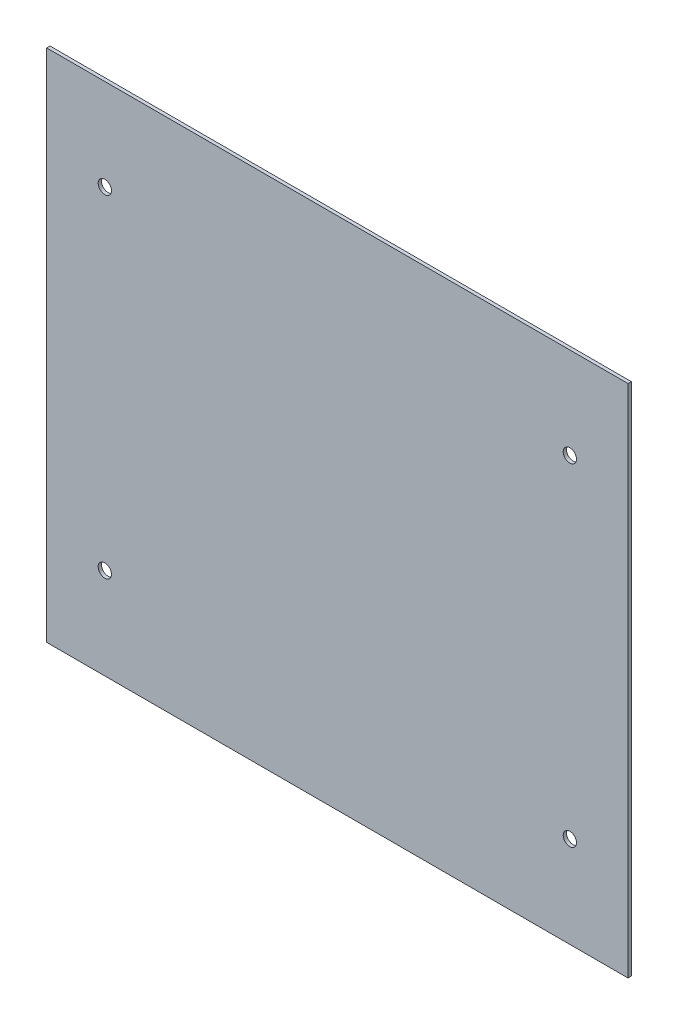
ISO-10303-21;
HEADER;
FILE_DESCRIPTION(('STEP AP214'),'2;1');
FILE_NAME('part.step','',(''),(''),'','','');
FILE_SCHEMA(('AUTOMOTIVE_DESIGN { 1 0 10303 214 1 1 1 1 }'));
ENDSEC;
DATA;
#1=APPLICATION_CONTEXT('core data for automotive mechanical design processes');
#2=APPLICATION_PROTOCOL_DEFINITION('international standard','automotive_design',2000,#1);
#3=PRODUCT_CONTEXT('',#1,'mechanical');
#4=PRODUCT('Part','Part','',(#3));
#5=PRODUCT_RELATED_PRODUCT_CATEGORY('part','',(#4));
#6=PRODUCT_DEFINITION_FORMATION('','',#4);
#7=PRODUCT_DEFINITION_CONTEXT('part definition',#1,'design');
#8=PRODUCT_DEFINITION('design','',#6,#7);
#9=PRODUCT_DEFINITION_SHAPE('','',#8);
#10=(LENGTH_UNIT() NAMED_UNIT(*) SI_UNIT(.MILLI.,.METRE.));
#11=(NAMED_UNIT(*) PLANE_ANGLE_UNIT() SI_UNIT($,.RADIAN.));
#12=(NAMED_UNIT(*) SI_UNIT($,.STERADIAN.) SOLID_ANGLE_UNIT());
#13=UNCERTAINTY_MEASURE_WITH_UNIT(LENGTH_MEASURE(1.E-05),#10,'distance_accuracy_value','');
#14=(GEOMETRIC_REPRESENTATION_CONTEXT(3) GLOBAL_UNCERTAINTY_ASSIGNED_CONTEXT((#13)) GLOBAL_UNIT_ASSIGNED_CONTEXT((#10,
#11,#12)) REPRESENTATION_CONTEXT('',''));
#15=CARTESIAN_POINT('',(0.,0.,0.));
#16=DIRECTION('',(0.,0.,1.));
#17=DIRECTION('',(1.,0.,0.));
#18=AXIS2_PLACEMENT_3D('',#15,#16,#17);
#19=CARTESIAN_POINT('',(-175.,-155.,2.));
#20=DIRECTION('',(1.,0.,0.));
#21=DIRECTION('',(0.,0.,-1.));
#22=AXIS2_PLACEMENT_3D('',#19,#20,#21);
#23=PLANE('',#22);
#24=DIRECTION('',(0.,-1.,0.));
#25=VECTOR('',#24,1.);
#26=CARTESIAN_POINT('',(-175.,-155.,0.));
#27=LINE('',#26,#25);
#28=CARTESIAN_POINT('',(-175.,155.,0.));
#29=VERTEX_POINT('',#28);
#30=CARTESIAN_POINT('',(-175.,-155.,0.));
#31=VERTEX_POINT('',#30);
#32=EDGE_CURVE('E96',#29,#31,#27,.T.);
#33=ORIENTED_EDGE('',*,*,#32,.T.);
#34=DIRECTION('',(0.,0.,-1.));
#35=VECTOR('',#34,1.);
#36=CARTESIAN_POINT('',(-175.,-155.,2.));
#37=LINE('',#36,#35);
#38=CARTESIAN_POINT('',(-175.,-155.,2.));
#39=VERTEX_POINT('',#38);
#40=EDGE_CURVE('E11',#39,#31,#37,.T.);
#41=ORIENTED_EDGE('',*,*,#40,.F.);
#42=DIRECTION('',(0.,-1.,0.));
#43=VECTOR('',#42,1.);
#44=CARTESIAN_POINT('',(-175.,-155.,2.));
#45=LINE('',#44,#43);
#46=CARTESIAN_POINT('',(-175.,155.,2.));
#47=VERTEX_POINT('',#46);
#48=EDGE_CURVE('E84',#47,#39,#45,.T.);
#49=ORIENTED_EDGE('',*,*,#48,.F.);
#50=DIRECTION('',(0.,0.,-1.));
#51=VECTOR('',#50,1.);
#52=CARTESIAN_POINT('',(-175.,155.,2.));
#53=LINE('',#52,#51);
#54=EDGE_CURVE('E92',#47,#29,#53,.T.);
#55=ORIENTED_EDGE('',*,*,#54,.T.);
#56=EDGE_LOOP('',(#33,#41,#49,#55));
#57=FACE_BOUND('',#56,.T.);
#58=ADVANCED_FACE('F33',(#57),#23,.F.);
#59=CARTESIAN_POINT('',(175.,-155.,2.));
#60=DIRECTION('',(0.,1.,0.));
#61=DIRECTION('',(-1.,0.,0.));
#62=AXIS2_PLACEMENT_3D('',#59,#60,#61);
#63=PLANE('',#62);
#64=DIRECTION('',(1.,0.,0.));
#65=VECTOR('',#64,1.);
#66=CARTESIAN_POINT('',(175.,-155.,0.));
#67=LINE('',#66,#65);
#68=CARTESIAN_POINT('',(175.,-155.,0.));
#69=VERTEX_POINT('',#68);
#70=EDGE_CURVE('E88',#31,#69,#67,.T.);
#71=ORIENTED_EDGE('',*,*,#70,.T.);
#72=DIRECTION('',(0.,0.,-1.));
#73=VECTOR('',#72,1.);
#74=CARTESIAN_POINT('',(175.,-155.,2.));
#75=LINE('',#74,#73);
#76=CARTESIAN_POINT('',(175.,-155.,2.));
#77=VERTEX_POINT('',#76);
#78=EDGE_CURVE('E41',#77,#69,#75,.T.);
#79=ORIENTED_EDGE('',*,*,#78,.F.);
#80=DIRECTION('',(1.,0.,0.));
#81=VECTOR('',#80,1.);
#82=CARTESIAN_POINT('',(175.,-155.,2.));
#83=LINE('',#82,#81);
#84=EDGE_CURVE('E79',#39,#77,#83,.T.);
#85=ORIENTED_EDGE('',*,*,#84,.F.);
#86=ORIENTED_EDGE('',*,*,#40,.T.);
#87=EDGE_LOOP('',(#71,#79,#85,#86));
#88=FACE_BOUND('',#87,.T.);
#89=ADVANCED_FACE('F87',(#88),#63,.F.);
#90=CARTESIAN_POINT('',(175.,-155.,2.));
#91=DIRECTION('',(-1.,0.,0.));
#92=DIRECTION('',(0.,0.,1.));
#93=AXIS2_PLACEMENT_3D('',#90,#91,#92);
#94=PLANE('',#93);
#95=DIRECTION('',(0.,1.,0.));
#96=VECTOR('',#95,1.);
#97=CARTESIAN_POINT('',(175.,-155.,0.));
#98=LINE('',#97,#96);
#99=CARTESIAN_POINT('',(175.,155.,0.));
#100=VERTEX_POINT('',#99);
#101=EDGE_CURVE('E66',#69,#100,#98,.T.);
#102=ORIENTED_EDGE('',*,*,#101,.T.);
#103=DIRECTION('',(0.,0.,-1.));
#104=VECTOR('',#103,1.);
#105=CARTESIAN_POINT('',(175.,155.,2.));
#106=LINE('',#105,#104);
#107=CARTESIAN_POINT('',(175.,155.,2.));
#108=VERTEX_POINT('',#107);
#109=EDGE_CURVE('E89',#108,#100,#106,.T.);
#110=ORIENTED_EDGE('',*,*,#109,.F.);
#111=DIRECTION('',(0.,1.,0.));
#112=VECTOR('',#111,1.);
#113=CARTESIAN_POINT('',(175.,-155.,2.));
#114=LINE('',#113,#112);
#115=EDGE_CURVE('E82',#77,#108,#114,.T.);
#116=ORIENTED_EDGE('',*,*,#115,.F.);
#117=ORIENTED_EDGE('',*,*,#78,.T.);
#118=EDGE_LOOP('',(#102,#110,#116,#117));
#119=FACE_BOUND('',#118,.T.);
#120=ADVANCED_FACE('F90',(#119),#94,.F.);
#121=CARTESIAN_POINT('',(175.,155.,2.));
#122=DIRECTION('',(0.,-1.,0.));
#123=DIRECTION('',(1.,0.,0.));
#124=AXIS2_PLACEMENT_3D('',#121,#122,#123);
#125=PLANE('',#124);
#126=DIRECTION('',(-1.,0.,0.));
#127=VECTOR('',#126,1.);
#128=CARTESIAN_POINT('',(175.,155.,0.));
#129=LINE('',#128,#127);
#130=EDGE_CURVE('E72',#100,#29,#129,.T.);
#131=ORIENTED_EDGE('',*,*,#130,.T.);
#132=ORIENTED_EDGE('',*,*,#54,.F.);
#133=DIRECTION('',(-1.,0.,0.));
#134=VECTOR('',#133,1.);
#135=CARTESIAN_POINT('',(175.,155.,2.));
#136=LINE('',#135,#134);
#137=EDGE_CURVE('E49',#108,#47,#136,.T.);
#138=ORIENTED_EDGE('',*,*,#137,.F.);
#139=ORIENTED_EDGE('',*,*,#109,.T.);
#140=EDGE_LOOP('',(#131,#132,#138,#139));
#141=FACE_BOUND('',#140,.T.);
#142=ADVANCED_FACE('F104',(#141),#125,.F.);
#143=CARTESIAN_POINT('',(0.,0.,2.));
#144=DIRECTION('',(0.,0.,1.));
#145=DIRECTION('',(1.,0.,0.));
#146=AXIS2_PLACEMENT_3D('',#143,#144,#145);
#147=PLANE('',#146);
#148=CARTESIAN_POINT('',(-140.,-100.,2.));
#149=DIRECTION('',(0.,0.,1.));
#150=DIRECTION('',(-1.,0.,0.));
#151=AXIS2_PLACEMENT_3D('',#148,#149,#150);
#152=CIRCLE('',#151,3.99999999999999);
#153=CARTESIAN_POINT('',(-144.,-100.,2.));
#154=VERTEX_POINT('',#153);
#155=EDGE_CURVE('E128',#154,#154,#152,.T.);
#156=ORIENTED_EDGE('',*,*,#155,.F.);
#157=EDGE_LOOP('',(#156));
#158=FACE_BOUND('',#157,.T.);
#159=CARTESIAN_POINT('',(140.,-100.,2.));
#160=DIRECTION('',(0.,0.,1.));
#161=DIRECTION('',(1.,0.,0.));
#162=AXIS2_PLACEMENT_3D('',#159,#160,#161);
#163=CIRCLE('',#162,3.99999999999999);
#164=CARTESIAN_POINT('',(144.,-100.,2.));
#165=VERTEX_POINT('',#164);
#166=EDGE_CURVE('E122',#165,#165,#163,.T.);
#167=ORIENTED_EDGE('',*,*,#166,.F.);
#168=EDGE_LOOP('',(#167));
#169=FACE_BOUND('',#168,.T.);
#170=CARTESIAN_POINT('',(140.,100.,2.));
#171=DIRECTION('',(0.,0.,1.));
#172=DIRECTION('',(-1.,0.,0.));
#173=AXIS2_PLACEMENT_3D('',#170,#171,#172);
#174=CIRCLE('',#173,3.99999999999999);
#175=CARTESIAN_POINT('',(136.,100.,2.));
#176=VERTEX_POINT('',#175);
#177=EDGE_CURVE('E116',#176,#176,#174,.T.);
#178=ORIENTED_EDGE('',*,*,#177,.F.);
#179=EDGE_LOOP('',(#178));
#180=FACE_BOUND('',#179,.T.);
#181=CARTESIAN_POINT('',(-140.,100.,2.));
#182=DIRECTION('',(0.,0.,1.));
#183=DIRECTION('',(1.,0.,0.));
#184=AXIS2_PLACEMENT_3D('',#181,#182,#183);
#185=CIRCLE('',#184,3.99999999999999);
#186=CARTESIAN_POINT('',(-136.,100.,2.));
#187=VERTEX_POINT('',#186);
#188=EDGE_CURVE('E110',#187,#187,#185,.T.);
#189=ORIENTED_EDGE('',*,*,#188,.F.);
#190=EDGE_LOOP('',(#189));
#191=FACE_BOUND('',#190,.T.);
#192=ORIENTED_EDGE('',*,*,#48,.T.);
#193=ORIENTED_EDGE('',*,*,#84,.T.);
#194=ORIENTED_EDGE('',*,*,#115,.T.);
#195=ORIENTED_EDGE('',*,*,#137,.T.);
#196=EDGE_LOOP('',(#192,#193,#194,#195));
#197=FACE_BOUND('',#196,.T.);
#198=ADVANCED_FACE('F80',(#158,#169,#180,#191,#197),#147,.T.);
#199=CARTESIAN_POINT('',(0.,0.,0.));
#200=DIRECTION('',(0.,0.,1.));
#201=DIRECTION('',(1.,0.,0.));
#202=AXIS2_PLACEMENT_3D('',#199,#200,#201);
#203=PLANE('',#202);
#204=CARTESIAN_POINT('',(-140.,-100.,0.));
#205=DIRECTION('',(0.,0.,1.));
#206=DIRECTION('',(-1.,0.,0.));
#207=AXIS2_PLACEMENT_3D('',#204,#205,#206);
#208=CIRCLE('',#207,3.99999999999999);
#209=CARTESIAN_POINT('',(-144.,-100.,0.));
#210=VERTEX_POINT('',#209);
#211=EDGE_CURVE('E113',#210,#210,#208,.T.);
#212=ORIENTED_EDGE('',*,*,#211,.T.);
#213=EDGE_LOOP('',(#212));
#214=FACE_BOUND('',#213,.T.);
#215=CARTESIAN_POINT('',(140.,-100.,0.));
#216=DIRECTION('',(0.,0.,1.));
#217=DIRECTION('',(1.,0.,0.));
#218=AXIS2_PLACEMENT_3D('',#215,#216,#217);
#219=CIRCLE('',#218,3.99999999999999);
#220=CARTESIAN_POINT('',(144.,-100.,0.));
#221=VERTEX_POINT('',#220);
#222=EDGE_CURVE('E125',#221,#221,#219,.T.);
#223=ORIENTED_EDGE('',*,*,#222,.T.);
#224=EDGE_LOOP('',(#223));
#225=FACE_BOUND('',#224,.T.);
#226=CARTESIAN_POINT('',(140.,100.,0.));
#227=DIRECTION('',(0.,0.,1.));
#228=DIRECTION('',(-1.,0.,0.));
#229=AXIS2_PLACEMENT_3D('',#226,#227,#228);
#230=CIRCLE('',#229,3.99999999999999);
#231=CARTESIAN_POINT('',(136.,100.,0.));
#232=VERTEX_POINT('',#231);
#233=EDGE_CURVE('E119',#232,#232,#230,.T.);
#234=ORIENTED_EDGE('',*,*,#233,.T.);
#235=EDGE_LOOP('',(#234));
#236=FACE_BOUND('',#235,.T.);
#237=CARTESIAN_POINT('',(-140.,100.,0.));
#238=DIRECTION('',(0.,0.,1.));
#239=DIRECTION('',(1.,0.,0.));
#240=AXIS2_PLACEMENT_3D('',#237,#238,#239);
#241=CIRCLE('',#240,3.99999999999999);
#242=CARTESIAN_POINT('',(-136.,100.,0.));
#243=VERTEX_POINT('',#242);
#244=EDGE_CURVE('E99',#243,#243,#241,.T.);
#245=ORIENTED_EDGE('',*,*,#244,.T.);
#246=EDGE_LOOP('',(#245));
#247=FACE_BOUND('',#246,.T.);
#248=ORIENTED_EDGE('',*,*,#32,.F.);
#249=ORIENTED_EDGE('',*,*,#130,.F.);
#250=ORIENTED_EDGE('',*,*,#101,.F.);
#251=ORIENTED_EDGE('',*,*,#70,.F.);
#252=EDGE_LOOP('',(#248,#249,#250,#251));
#253=FACE_BOUND('',#252,.T.);
#254=ADVANCED_FACE('F107',(#214,#225,#236,#247,#253),#203,.F.);
#255=CARTESIAN_POINT('',(-140.,100.,0.));
#256=DIRECTION('',(0.,0.,1.));
#257=DIRECTION('',(1.,0.,0.));
#258=AXIS2_PLACEMENT_3D('',#255,#256,#257);
#259=CYLINDRICAL_SURFACE('',#258,3.99999999999999);
#260=ORIENTED_EDGE('',*,*,#244,.F.);
#261=EDGE_LOOP('',(#260));
#262=FACE_BOUND('',#261,.T.);
#263=ORIENTED_EDGE('',*,*,#188,.T.);
#264=EDGE_LOOP('',(#263));
#265=FACE_BOUND('',#264,.T.);
#266=ADVANCED_FACE('F152',(#262,#265),#259,.F.);
#267=CARTESIAN_POINT('',(140.,100.,0.));
#268=DIRECTION('',(0.,0.,1.));
#269=DIRECTION('',(1.,0.,0.));
#270=AXIS2_PLACEMENT_3D('',#267,#268,#269);
#271=CYLINDRICAL_SURFACE('',#270,3.99999999999999);
#272=ORIENTED_EDGE('',*,*,#233,.F.);
#273=EDGE_LOOP('',(#272));
#274=FACE_BOUND('',#273,.T.);
#275=ORIENTED_EDGE('',*,*,#177,.T.);
#276=EDGE_LOOP('',(#275));
#277=FACE_BOUND('',#276,.T.);
#278=ADVANCED_FACE('F154',(#274,#277),#271,.F.);
#279=CARTESIAN_POINT('',(140.,-100.,0.));
#280=DIRECTION('',(0.,0.,1.));
#281=DIRECTION('',(1.,0.,0.));
#282=AXIS2_PLACEMENT_3D('',#279,#280,#281);
#283=CYLINDRICAL_SURFACE('',#282,3.99999999999999);
#284=ORIENTED_EDGE('',*,*,#222,.F.);
#285=EDGE_LOOP('',(#284));
#286=FACE_BOUND('',#285,.T.);
#287=ORIENTED_EDGE('',*,*,#166,.T.);
#288=EDGE_LOOP('',(#287));
#289=FACE_BOUND('',#288,.T.);
#290=ADVANCED_FACE('F139',(#286,#289),#283,.F.);
#291=CARTESIAN_POINT('',(-140.,-100.,0.));
#292=DIRECTION('',(0.,0.,1.));
#293=DIRECTION('',(1.,0.,0.));
#294=AXIS2_PLACEMENT_3D('',#291,#292,#293);
#295=CYLINDRICAL_SURFACE('',#294,3.99999999999999);
#296=ORIENTED_EDGE('',*,*,#211,.F.);
#297=EDGE_LOOP('',(#296));
#298=FACE_BOUND('',#297,.T.);
#299=ORIENTED_EDGE('',*,*,#155,.T.);
#300=EDGE_LOOP('',(#299));
#301=FACE_BOUND('',#300,.T.);
#302=ADVANCED_FACE('F136',(#298,#301),#295,.F.);
#303=CLOSED_SHELL('',(#58,#89,#120,#142,#198,#254,#266,#278,#290,#302));
#304=MANIFOLD_SOLID_BREP('B2',#303);
#305=ADVANCED_BREP_SHAPE_REPRESENTATION('',(#18,#304),#14);
#306=SHAPE_DEFINITION_REPRESENTATION(#9,#305);
ENDSEC;
END-ISO-10303-21;
